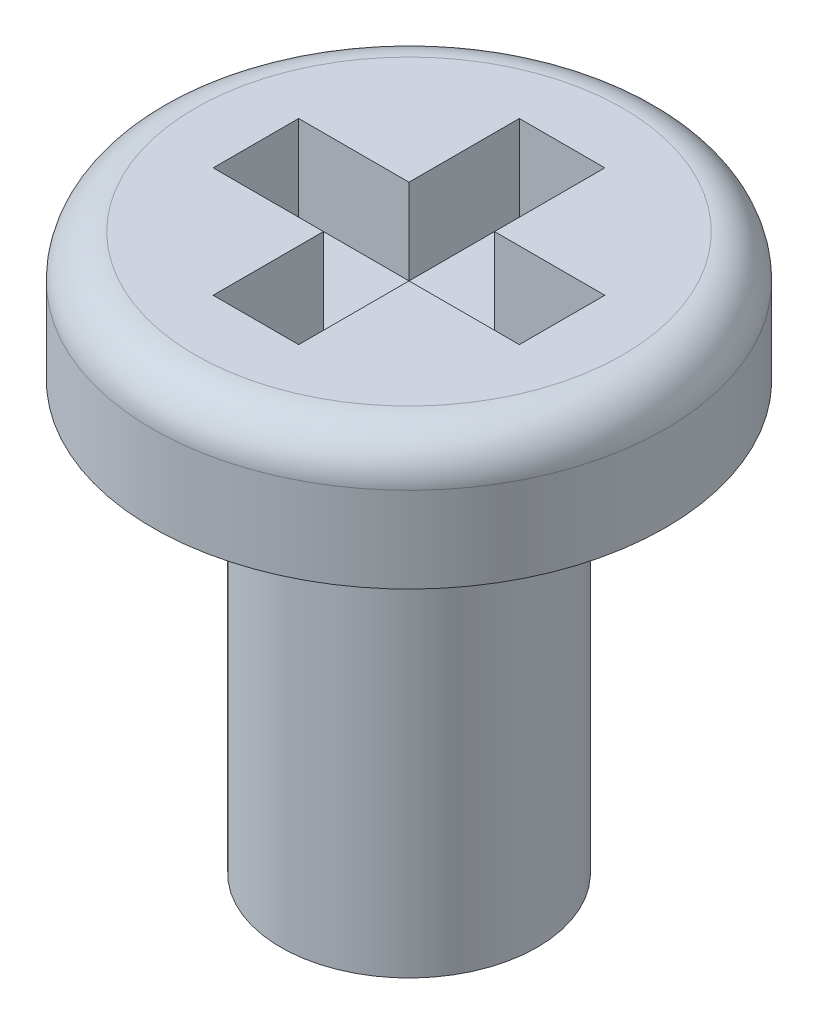
ISO-10303-21;
HEADER;
FILE_DESCRIPTION(('STEP AP214'),'2;1');
FILE_NAME('part.step','',(''),(''),'','','');
FILE_SCHEMA(('AUTOMOTIVE_DESIGN { 1 0 10303 214 1 1 1 1 }'));
ENDSEC;
DATA;
#1=APPLICATION_CONTEXT('core data for automotive mechanical design processes');
#2=APPLICATION_PROTOCOL_DEFINITION('international standard','automotive_design',2000,#1);
#3=PRODUCT_CONTEXT('',#1,'mechanical');
#4=PRODUCT('Part','Part','',(#3));
#5=PRODUCT_RELATED_PRODUCT_CATEGORY('part','',(#4));
#6=PRODUCT_DEFINITION_FORMATION('','',#4);
#7=PRODUCT_DEFINITION_CONTEXT('part definition',#1,'design');
#8=PRODUCT_DEFINITION('design','',#6,#7);
#9=PRODUCT_DEFINITION_SHAPE('','',#8);
#10=(LENGTH_UNIT() NAMED_UNIT(*) SI_UNIT(.MILLI.,.METRE.));
#11=(NAMED_UNIT(*) PLANE_ANGLE_UNIT() SI_UNIT($,.RADIAN.));
#12=(NAMED_UNIT(*) SI_UNIT($,.STERADIAN.) SOLID_ANGLE_UNIT());
#13=UNCERTAINTY_MEASURE_WITH_UNIT(LENGTH_MEASURE(1.E-05),#10,'distance_accuracy_value','');
#14=(GEOMETRIC_REPRESENTATION_CONTEXT(3) GLOBAL_UNCERTAINTY_ASSIGNED_CONTEXT((#13)) GLOBAL_UNIT_ASSIGNED_CONTEXT((#10,
#11,#12)) REPRESENTATION_CONTEXT('',''));
#15=CARTESIAN_POINT('',(0.,0.,0.));
#16=DIRECTION('',(0.,0.,1.));
#17=DIRECTION('',(1.,0.,0.));
#18=AXIS2_PLACEMENT_3D('',#15,#16,#17);
#19=CARTESIAN_POINT('',(-3.,1.75,0.));
#20=DIRECTION('',(0.,1.,0.));
#21=DIRECTION('',(-1.,0.,0.));
#22=AXIS2_PLACEMENT_3D('',#19,#20,#21);
#23=PLANE('',#22);
#24=CARTESIAN_POINT('',(0.,1.75,0.));
#25=DIRECTION('',(0.,-1.,0.));
#26=DIRECTION('',(1.,0.,0.));
#27=AXIS2_PLACEMENT_3D('',#24,#25,#26);
#28=CIRCLE('',#27,1.5);
#29=CARTESIAN_POINT('',(1.5,1.75,0.));
#30=VERTEX_POINT('',#29);
#31=EDGE_CURVE('E12',#30,#30,#28,.T.);
#32=ORIENTED_EDGE('',*,*,#31,.F.);
#33=EDGE_LOOP('',(#32));
#34=FACE_BOUND('',#33,.T.);
#35=CARTESIAN_POINT('',(0.,1.75,0.));
#36=DIRECTION('',(0.,-1.,0.));
#37=DIRECTION('',(1.,0.,0.));
#38=AXIS2_PLACEMENT_3D('',#35,#36,#37);
#39=CIRCLE('',#38,3.);
#40=CARTESIAN_POINT('',(3.,1.75,0.));
#41=VERTEX_POINT('',#40);
#42=EDGE_CURVE('E201',#41,#41,#39,.T.);
#43=ORIENTED_EDGE('',*,*,#42,.T.);
#44=EDGE_LOOP('',(#43));
#45=FACE_BOUND('',#44,.T.);
#46=ADVANCED_FACE('F38',(#34,#45),#23,.F.);
#47=CARTESIAN_POINT('',(0.,-3.25,0.));
#48=DIRECTION('',(0.,-1.,0.));
#49=DIRECTION('',(1.,0.,0.));
#50=AXIS2_PLACEMENT_3D('',#47,#48,#49);
#51=CYLINDRICAL_SURFACE('',#50,1.5);
#52=CARTESIAN_POINT('',(0.,-3.25,0.));
#53=DIRECTION('',(0.,-1.,0.));
#54=DIRECTION('',(1.,0.,0.));
#55=AXIS2_PLACEMENT_3D('',#52,#53,#54);
#56=CIRCLE('',#55,1.5);
#57=CARTESIAN_POINT('',(1.5,-3.25,0.));
#58=VERTEX_POINT('',#57);
#59=EDGE_CURVE('E45',#58,#58,#56,.T.);
#60=ORIENTED_EDGE('',*,*,#59,.F.);
#61=EDGE_LOOP('',(#60));
#62=FACE_BOUND('',#61,.T.);
#63=ORIENTED_EDGE('',*,*,#31,.T.);
#64=EDGE_LOOP('',(#63));
#65=FACE_BOUND('',#64,.T.);
#66=ADVANCED_FACE('F215',(#62,#65),#51,.T.);
#67=CARTESIAN_POINT('',(-1.5,-3.25,0.));
#68=DIRECTION('',(0.,1.,0.));
#69=DIRECTION('',(-1.,0.,0.));
#70=AXIS2_PLACEMENT_3D('',#67,#68,#69);
#71=PLANE('',#70);
#72=ORIENTED_EDGE('',*,*,#59,.T.);
#73=EDGE_LOOP('',(#72));
#74=FACE_BOUND('',#73,.T.);
#75=ADVANCED_FACE('F213',(#74),#71,.F.);
#76=CARTESIAN_POINT('',(0.,3.25,0.));
#77=DIRECTION('',(0.,-1.,0.));
#78=DIRECTION('',(1.,0.,0.));
#79=AXIS2_PLACEMENT_3D('',#76,#77,#78);
#80=PLANE('',#79);
#81=DIRECTION('',(-1.,0.,0.));
#82=VECTOR('',#81,1.);
#83=CARTESIAN_POINT('',(-0.5,3.25,-0.5));
#84=LINE('',#83,#82);
#85=CARTESIAN_POINT('',(-0.5,3.25,-0.5));
#86=VERTEX_POINT('',#85);
#87=CARTESIAN_POINT('',(-1.79032258064516,3.25,-0.5));
#88=VERTEX_POINT('',#87);
#89=EDGE_CURVE('E142',#86,#88,#84,.T.);
#90=ORIENTED_EDGE('',*,*,#89,.F.);
#91=DIRECTION('',(0.,0.,1.));
#92=VECTOR('',#91,1.);
#93=CARTESIAN_POINT('',(-0.500000000000001,3.25,-1.79032258064516));
#94=LINE('',#93,#92);
#95=CARTESIAN_POINT('',(-0.500000000000001,3.25,-1.79032258064516));
#96=VERTEX_POINT('',#95);
#97=EDGE_CURVE('E52',#96,#86,#94,.T.);
#98=ORIENTED_EDGE('',*,*,#97,.F.);
#99=DIRECTION('',(-1.,0.,0.));
#100=VECTOR('',#99,1.);
#101=CARTESIAN_POINT('',(-0.500000000000001,3.25,-1.79032258064516));
#102=LINE('',#101,#100);
#103=CARTESIAN_POINT('',(0.499999999999999,3.25,-1.79032258064516));
#104=VERTEX_POINT('',#103);
#105=EDGE_CURVE('E176',#104,#96,#102,.T.);
#106=ORIENTED_EDGE('',*,*,#105,.F.);
#107=DIRECTION('',(0.,0.,-1.));
#108=VECTOR('',#107,1.);
#109=CARTESIAN_POINT('',(0.499999999999999,3.25,-1.79032258064516));
#110=LINE('',#109,#108);
#111=CARTESIAN_POINT('',(0.499999999999998,3.25,-0.5));
#112=VERTEX_POINT('',#111);
#113=EDGE_CURVE('E173',#112,#104,#110,.T.);
#114=ORIENTED_EDGE('',*,*,#113,.F.);
#115=DIRECTION('',(-1.,0.,0.));
#116=VECTOR('',#115,1.);
#117=CARTESIAN_POINT('',(0.499999999999998,3.25,-0.5));
#118=LINE('',#117,#116);
#119=CARTESIAN_POINT('',(1.79032258064516,3.25,-0.5));
#120=VERTEX_POINT('',#119);
#121=EDGE_CURVE('E170',#120,#112,#118,.T.);
#122=ORIENTED_EDGE('',*,*,#121,.F.);
#123=DIRECTION('',(0.,0.,-1.));
#124=VECTOR('',#123,1.);
#125=CARTESIAN_POINT('',(1.79032258064516,3.25,-0.5));
#126=LINE('',#125,#124);
#127=CARTESIAN_POINT('',(1.79032258064516,3.25,0.5));
#128=VERTEX_POINT('',#127);
#129=EDGE_CURVE('E167',#128,#120,#126,.T.);
#130=ORIENTED_EDGE('',*,*,#129,.F.);
#131=DIRECTION('',(1.,0.,0.));
#132=VECTOR('',#131,1.);
#133=CARTESIAN_POINT('',(0.499999999999996,3.25,0.5));
#134=LINE('',#133,#132);
#135=CARTESIAN_POINT('',(0.499999999999996,3.25,0.5));
#136=VERTEX_POINT('',#135);
#137=EDGE_CURVE('E164',#136,#128,#134,.T.);
#138=ORIENTED_EDGE('',*,*,#137,.F.);
#139=DIRECTION('',(0.,0.,-1.));
#140=VECTOR('',#139,1.);
#141=CARTESIAN_POINT('',(0.499999999999996,3.25,0.5));
#142=LINE('',#141,#140);
#143=CARTESIAN_POINT('',(0.499999999999997,3.25,1.79032258064516));
#144=VERTEX_POINT('',#143);
#145=EDGE_CURVE('E161',#144,#136,#142,.T.);
#146=ORIENTED_EDGE('',*,*,#145,.F.);
#147=DIRECTION('',(1.,0.,0.));
#148=VECTOR('',#147,1.);
#149=CARTESIAN_POINT('',(0.499999999999997,3.25,1.79032258064516));
#150=LINE('',#149,#148);
#151=CARTESIAN_POINT('',(-0.500000000000003,3.25,1.79032258064516));
#152=VERTEX_POINT('',#151);
#153=EDGE_CURVE('E158',#152,#144,#150,.T.);
#154=ORIENTED_EDGE('',*,*,#153,.F.);
#155=DIRECTION('',(0.,0.,1.));
#156=VECTOR('',#155,1.);
#157=CARTESIAN_POINT('',(-0.500000000000001,3.25,0.5));
#158=LINE('',#157,#156);
#159=CARTESIAN_POINT('',(-0.500000000000001,3.25,0.5));
#160=VERTEX_POINT('',#159);
#161=EDGE_CURVE('E152',#160,#152,#158,.T.);
#162=ORIENTED_EDGE('',*,*,#161,.F.);
#163=DIRECTION('',(1.,0.,0.));
#164=VECTOR('',#163,1.);
#165=CARTESIAN_POINT('',(-0.500000000000001,3.25,0.5));
#166=LINE('',#165,#164);
#167=CARTESIAN_POINT('',(-1.79032258064516,3.25,0.5));
#168=VERTEX_POINT('',#167);
#169=EDGE_CURVE('E150',#168,#160,#166,.T.);
#170=ORIENTED_EDGE('',*,*,#169,.F.);
#171=DIRECTION('',(0.,0.,1.));
#172=VECTOR('',#171,1.);
#173=CARTESIAN_POINT('',(-1.79032258064516,3.25,0.5));
#174=LINE('',#173,#172);
#175=EDGE_CURVE('E133',#88,#168,#174,.T.);
#176=ORIENTED_EDGE('',*,*,#175,.F.);
#177=EDGE_LOOP('',(#90,#98,#106,#114,#122,#130,#138,#146,#154,#162,#170,#176));
#178=FACE_BOUND('',#177,.T.);
#179=CARTESIAN_POINT('',(0.,3.25,0.));
#180=DIRECTION('',(0.,-1.,0.));
#181=DIRECTION('',(1.,0.,0.));
#182=AXIS2_PLACEMENT_3D('',#179,#180,#181);
#183=CIRCLE('',#182,2.5);
#184=CARTESIAN_POINT('',(2.5,3.25,0.));
#185=VERTEX_POINT('',#184);
#186=EDGE_CURVE('E208',#185,#185,#183,.T.);
#187=ORIENTED_EDGE('',*,*,#186,.F.);
#188=EDGE_LOOP('',(#187));
#189=FACE_BOUND('',#188,.T.);
#190=ADVANCED_FACE('F146',(#178,#189),#80,.F.);
#191=CARTESIAN_POINT('',(0.,2.75,0.));
#192=DIRECTION('',(0.,-1.,0.));
#193=DIRECTION('',(1.,0.,0.));
#194=AXIS2_PLACEMENT_3D('',#191,#192,#193);
#195=TOROIDAL_SURFACE('',#194,2.5,0.5);
#196=CARTESIAN_POINT('',(0.,2.75,0.));
#197=DIRECTION('',(0.,-1.,0.));
#198=DIRECTION('',(1.,0.,0.));
#199=AXIS2_PLACEMENT_3D('',#196,#197,#198);
#200=CIRCLE('',#199,3.);
#201=CARTESIAN_POINT('',(3.,2.75,0.));
#202=VERTEX_POINT('',#201);
#203=EDGE_CURVE('E205',#202,#202,#200,.T.);
#204=ORIENTED_EDGE('',*,*,#203,.F.);
#205=EDGE_LOOP('',(#204));
#206=FACE_BOUND('',#205,.T.);
#207=ORIENTED_EDGE('',*,*,#186,.T.);
#208=EDGE_LOOP('',(#207));
#209=FACE_BOUND('',#208,.T.);
#210=ADVANCED_FACE('F228',(#206,#209),#195,.T.);
#211=CARTESIAN_POINT('',(0.,-3.25,0.));
#212=DIRECTION('',(0.,-1.,0.));
#213=DIRECTION('',(1.,0.,0.));
#214=AXIS2_PLACEMENT_3D('',#211,#212,#213);
#215=CYLINDRICAL_SURFACE('',#214,3.);
#216=ORIENTED_EDGE('',*,*,#42,.F.);
#217=EDGE_LOOP('',(#216));
#218=FACE_BOUND('',#217,.T.);
#219=ORIENTED_EDGE('',*,*,#203,.T.);
#220=EDGE_LOOP('',(#219));
#221=FACE_BOUND('',#220,.T.);
#222=ADVANCED_FACE('F224',(#218,#221),#215,.T.);
#223=CARTESIAN_POINT('',(-0.5,-3.31379694914238,-1.79032258064516));
#224=DIRECTION('',(-1.,0.,0.));
#225=DIRECTION('',(0.,0.,1.));
#226=AXIS2_PLACEMENT_3D('',#223,#224,#225);
#227=PLANE('',#226);
#228=DIRECTION('',(0.,0.,-1.));
#229=VECTOR('',#228,1.);
#230=CARTESIAN_POINT('',(-0.500000000000001,2.25,-1.79032258064516));
#231=LINE('',#230,#229);
#232=CARTESIAN_POINT('',(-0.5,2.25,-0.5));
#233=VERTEX_POINT('',#232);
#234=CARTESIAN_POINT('',(-0.500000000000001,2.25,-1.79032258064516));
#235=VERTEX_POINT('',#234);
#236=EDGE_CURVE('E202',#233,#235,#231,.T.);
#237=ORIENTED_EDGE('',*,*,#236,.T.);
#238=DIRECTION('',(0.,1.,0.));
#239=VECTOR('',#238,1.);
#240=CARTESIAN_POINT('',(-0.5,-3.31379694914238,-1.79032258064516));
#241=LINE('',#240,#239);
#242=EDGE_CURVE('E179',#235,#96,#241,.T.);
#243=ORIENTED_EDGE('',*,*,#242,.T.);
#244=ORIENTED_EDGE('',*,*,#97,.T.);
#245=DIRECTION('',(0.,1.,0.));
#246=VECTOR('',#245,1.);
#247=CARTESIAN_POINT('',(-0.5,-3.31379694914238,-0.5));
#248=LINE('',#247,#246);
#249=EDGE_CURVE('E139',#233,#86,#248,.T.);
#250=ORIENTED_EDGE('',*,*,#249,.F.);
#251=EDGE_LOOP('',(#237,#243,#244,#250));
#252=FACE_BOUND('',#251,.T.);
#253=ADVANCED_FACE('F227',(#252),#227,.F.);
#254=CARTESIAN_POINT('',(-0.5,-3.31379694914238,-1.79032258064516));
#255=DIRECTION('',(0.,0.,-1.));
#256=DIRECTION('',(-1.,0.,0.));
#257=AXIS2_PLACEMENT_3D('',#254,#255,#256);
#258=PLANE('',#257);
#259=DIRECTION('',(1.,0.,0.));
#260=VECTOR('',#259,1.);
#261=CARTESIAN_POINT('',(-0.500000000000001,2.25,-1.79032258064516));
#262=LINE('',#261,#260);
#263=CARTESIAN_POINT('',(0.499999999999999,2.25,-1.79032258064516));
#264=VERTEX_POINT('',#263);
#265=EDGE_CURVE('E292',#235,#264,#262,.T.);
#266=ORIENTED_EDGE('',*,*,#265,.T.);
#267=DIRECTION('',(0.,1.,0.));
#268=VECTOR('',#267,1.);
#269=CARTESIAN_POINT('',(0.5,-3.31379694914238,-1.79032258064516));
#270=LINE('',#269,#268);
#271=EDGE_CURVE('E181',#264,#104,#270,.T.);
#272=ORIENTED_EDGE('',*,*,#271,.T.);
#273=ORIENTED_EDGE('',*,*,#105,.T.);
#274=ORIENTED_EDGE('',*,*,#242,.F.);
#275=EDGE_LOOP('',(#266,#272,#273,#274));
#276=FACE_BOUND('',#275,.T.);
#277=ADVANCED_FACE('F245',(#276),#258,.F.);
#278=CARTESIAN_POINT('',(0.5,-3.31379694914238,-1.79032258064516));
#279=DIRECTION('',(1.,0.,0.));
#280=DIRECTION('',(0.,0.,-1.));
#281=AXIS2_PLACEMENT_3D('',#278,#279,#280);
#282=PLANE('',#281);
#283=DIRECTION('',(0.,0.,1.));
#284=VECTOR('',#283,1.);
#285=CARTESIAN_POINT('',(0.499999999999999,2.25,-1.79032258064516));
#286=LINE('',#285,#284);
#287=CARTESIAN_POINT('',(0.499999999999998,2.25,-0.5));
#288=VERTEX_POINT('',#287);
#289=EDGE_CURVE('E295',#264,#288,#286,.T.);
#290=ORIENTED_EDGE('',*,*,#289,.T.);
#291=DIRECTION('',(0.,1.,0.));
#292=VECTOR('',#291,1.);
#293=CARTESIAN_POINT('',(0.499999999999999,-3.31379694914238,-0.5));
#294=LINE('',#293,#292);
#295=EDGE_CURVE('E183',#288,#112,#294,.T.);
#296=ORIENTED_EDGE('',*,*,#295,.T.);
#297=ORIENTED_EDGE('',*,*,#113,.T.);
#298=ORIENTED_EDGE('',*,*,#271,.F.);
#299=EDGE_LOOP('',(#290,#296,#297,#298));
#300=FACE_BOUND('',#299,.T.);
#301=ADVANCED_FACE('F277',(#300),#282,.F.);
#302=CARTESIAN_POINT('',(0.499999999999999,-3.31379694914238,-0.5));
#303=DIRECTION('',(0.,0.,-1.));
#304=DIRECTION('',(-1.,0.,0.));
#305=AXIS2_PLACEMENT_3D('',#302,#303,#304);
#306=PLANE('',#305);
#307=DIRECTION('',(1.,0.,0.));
#308=VECTOR('',#307,1.);
#309=CARTESIAN_POINT('',(0.499999999999998,2.25,-0.5));
#310=LINE('',#309,#308);
#311=CARTESIAN_POINT('',(1.79032258064516,2.25,-0.5));
#312=VERTEX_POINT('',#311);
#313=EDGE_CURVE('E299',#288,#312,#310,.T.);
#314=ORIENTED_EDGE('',*,*,#313,.T.);
#315=DIRECTION('',(0.,1.,0.));
#316=VECTOR('',#315,1.);
#317=CARTESIAN_POINT('',(1.79032258064516,-3.31379694914238,-0.5));
#318=LINE('',#317,#316);
#319=EDGE_CURVE('E185',#312,#120,#318,.T.);
#320=ORIENTED_EDGE('',*,*,#319,.T.);
#321=ORIENTED_EDGE('',*,*,#121,.T.);
#322=ORIENTED_EDGE('',*,*,#295,.F.);
#323=EDGE_LOOP('',(#314,#320,#321,#322));
#324=FACE_BOUND('',#323,.T.);
#325=ADVANCED_FACE('F273',(#324),#306,.F.);
#326=CARTESIAN_POINT('',(1.79032258064516,-3.31379694914238,-0.5));
#327=DIRECTION('',(1.,0.,0.));
#328=DIRECTION('',(0.,1.,0.));
#329=AXIS2_PLACEMENT_3D('',#326,#327,#328);
#330=PLANE('',#329);
#331=DIRECTION('',(0.,0.,1.));
#332=VECTOR('',#331,1.);
#333=CARTESIAN_POINT('',(1.79032258064516,2.25,-0.5));
#334=LINE('',#333,#332);
#335=CARTESIAN_POINT('',(1.79032258064516,2.25,0.5));
#336=VERTEX_POINT('',#335);
#337=EDGE_CURVE('E301',#312,#336,#334,.T.);
#338=ORIENTED_EDGE('',*,*,#337,.T.);
#339=DIRECTION('',(0.,1.,0.));
#340=VECTOR('',#339,1.);
#341=CARTESIAN_POINT('',(1.79032258064516,-3.31379694914238,0.5));
#342=LINE('',#341,#340);
#343=EDGE_CURVE('E187',#336,#128,#342,.T.);
#344=ORIENTED_EDGE('',*,*,#343,.T.);
#345=ORIENTED_EDGE('',*,*,#129,.T.);
#346=ORIENTED_EDGE('',*,*,#319,.F.);
#347=EDGE_LOOP('',(#338,#344,#345,#346));
#348=FACE_BOUND('',#347,.T.);
#349=ADVANCED_FACE('F269',(#348),#330,.F.);
#350=CARTESIAN_POINT('',(0.499999999999997,-3.31379694914238,0.5));
#351=DIRECTION('',(0.,0.,1.));
#352=DIRECTION('',(1.,0.,0.));
#353=AXIS2_PLACEMENT_3D('',#350,#351,#352);
#354=PLANE('',#353);
#355=DIRECTION('',(-1.,0.,0.));
#356=VECTOR('',#355,1.);
#357=CARTESIAN_POINT('',(0.499999999999997,2.25,0.5));
#358=LINE('',#357,#356);
#359=CARTESIAN_POINT('',(0.499999999999997,2.25,0.5));
#360=VERTEX_POINT('',#359);
#361=EDGE_CURVE('E303',#336,#360,#358,.T.);
#362=ORIENTED_EDGE('',*,*,#361,.T.);
#363=DIRECTION('',(0.,1.,0.));
#364=VECTOR('',#363,1.);
#365=CARTESIAN_POINT('',(0.499999999999997,-3.31379694914238,0.5));
#366=LINE('',#365,#364);
#367=EDGE_CURVE('E189',#360,#136,#366,.T.);
#368=ORIENTED_EDGE('',*,*,#367,.T.);
#369=ORIENTED_EDGE('',*,*,#137,.T.);
#370=ORIENTED_EDGE('',*,*,#343,.F.);
#371=EDGE_LOOP('',(#362,#368,#369,#370));
#372=FACE_BOUND('',#371,.T.);
#373=ADVANCED_FACE('F265',(#372),#354,.F.);
#374=CARTESIAN_POINT('',(0.499999999999997,-3.31379694914238,0.5));
#375=DIRECTION('',(1.,0.,0.));
#376=DIRECTION('',(0.,1.,0.));
#377=AXIS2_PLACEMENT_3D('',#374,#375,#376);
#378=PLANE('',#377);
#379=DIRECTION('',(0.,0.,1.));
#380=VECTOR('',#379,1.);
#381=CARTESIAN_POINT('',(0.499999999999997,2.25,0.5));
#382=LINE('',#381,#380);
#383=CARTESIAN_POINT('',(0.499999999999997,2.25,1.79032258064516));
#384=VERTEX_POINT('',#383);
#385=EDGE_CURVE('E305',#360,#384,#382,.T.);
#386=ORIENTED_EDGE('',*,*,#385,.T.);
#387=DIRECTION('',(0.,1.,0.));
#388=VECTOR('',#387,1.);
#389=CARTESIAN_POINT('',(0.499999999999997,-3.31379694914238,1.79032258064516));
#390=LINE('',#389,#388);
#391=EDGE_CURVE('E191',#384,#144,#390,.T.);
#392=ORIENTED_EDGE('',*,*,#391,.T.);
#393=ORIENTED_EDGE('',*,*,#145,.T.);
#394=ORIENTED_EDGE('',*,*,#367,.F.);
#395=EDGE_LOOP('',(#386,#392,#393,#394));
#396=FACE_BOUND('',#395,.T.);
#397=ADVANCED_FACE('F261',(#396),#378,.F.);
#398=CARTESIAN_POINT('',(0.499999999999997,-3.31379694914238,1.79032258064516));
#399=DIRECTION('',(0.,0.,1.));
#400=DIRECTION('',(1.,0.,0.));
#401=AXIS2_PLACEMENT_3D('',#398,#399,#400);
#402=PLANE('',#401);
#403=DIRECTION('',(-1.,0.,0.));
#404=VECTOR('',#403,1.);
#405=CARTESIAN_POINT('',(0.499999999999997,2.25,1.79032258064516));
#406=LINE('',#405,#404);
#407=CARTESIAN_POINT('',(-0.500000000000003,2.25,1.79032258064516));
#408=VERTEX_POINT('',#407);
#409=EDGE_CURVE('E307',#384,#408,#406,.T.);
#410=ORIENTED_EDGE('',*,*,#409,.T.);
#411=DIRECTION('',(0.,1.,0.));
#412=VECTOR('',#411,1.);
#413=CARTESIAN_POINT('',(-0.500000000000003,-3.31379694914238,1.79032258064516));
#414=LINE('',#413,#412);
#415=EDGE_CURVE('E193',#408,#152,#414,.T.);
#416=ORIENTED_EDGE('',*,*,#415,.T.);
#417=ORIENTED_EDGE('',*,*,#153,.T.);
#418=ORIENTED_EDGE('',*,*,#391,.F.);
#419=EDGE_LOOP('',(#410,#416,#417,#418));
#420=FACE_BOUND('',#419,.T.);
#421=ADVANCED_FACE('F257',(#420),#402,.F.);
#422=CARTESIAN_POINT('',(-0.5,-3.31379694914238,0.5));
#423=DIRECTION('',(-1.,0.,0.));
#424=DIRECTION('',(0.,0.,1.));
#425=AXIS2_PLACEMENT_3D('',#422,#423,#424);
#426=PLANE('',#425);
#427=DIRECTION('',(0.,0.,-1.));
#428=VECTOR('',#427,1.);
#429=CARTESIAN_POINT('',(-0.500000000000001,2.25,0.5));
#430=LINE('',#429,#428);
#431=CARTESIAN_POINT('',(-0.5,2.25,0.5));
#432=VERTEX_POINT('',#431);
#433=EDGE_CURVE('E309',#408,#432,#430,.T.);
#434=ORIENTED_EDGE('',*,*,#433,.T.);
#435=DIRECTION('',(0.,1.,0.));
#436=VECTOR('',#435,1.);
#437=CARTESIAN_POINT('',(-0.5,-3.31379694914238,0.5));
#438=LINE('',#437,#436);
#439=EDGE_CURVE('E195',#432,#160,#438,.T.);
#440=ORIENTED_EDGE('',*,*,#439,.T.);
#441=ORIENTED_EDGE('',*,*,#161,.T.);
#442=ORIENTED_EDGE('',*,*,#415,.F.);
#443=EDGE_LOOP('',(#434,#440,#441,#442));
#444=FACE_BOUND('',#443,.T.);
#445=ADVANCED_FACE('F254',(#444),#426,.F.);
#446=CARTESIAN_POINT('',(-0.5,-3.31379694914238,0.5));
#447=DIRECTION('',(0.,0.,1.));
#448=DIRECTION('',(1.,0.,0.));
#449=AXIS2_PLACEMENT_3D('',#446,#447,#448);
#450=PLANE('',#449);
#451=DIRECTION('',(-1.,0.,0.));
#452=VECTOR('',#451,1.);
#453=CARTESIAN_POINT('',(-0.500000000000001,2.25,0.5));
#454=LINE('',#453,#452);
#455=CARTESIAN_POINT('',(-1.79032258064516,2.25,0.5));
#456=VERTEX_POINT('',#455);
#457=EDGE_CURVE('E60',#432,#456,#454,.T.);
#458=ORIENTED_EDGE('',*,*,#457,.T.);
#459=DIRECTION('',(0.,1.,0.));
#460=VECTOR('',#459,1.);
#461=CARTESIAN_POINT('',(-1.79032258064516,-3.31379694914238,0.5));
#462=LINE('',#461,#460);
#463=EDGE_CURVE('E138',#456,#168,#462,.T.);
#464=ORIENTED_EDGE('',*,*,#463,.T.);
#465=ORIENTED_EDGE('',*,*,#169,.T.);
#466=ORIENTED_EDGE('',*,*,#439,.F.);
#467=EDGE_LOOP('',(#458,#464,#465,#466));
#468=FACE_BOUND('',#467,.T.);
#469=ADVANCED_FACE('F251',(#468),#450,.F.);
#470=CARTESIAN_POINT('',(-1.79032258064516,-3.31379694914238,0.5));
#471=DIRECTION('',(-1.,0.,0.));
#472=DIRECTION('',(0.,0.,1.));
#473=AXIS2_PLACEMENT_3D('',#470,#471,#472);
#474=PLANE('',#473);
#475=DIRECTION('',(0.,0.,-1.));
#476=VECTOR('',#475,1.);
#477=CARTESIAN_POINT('',(-1.79032258064516,2.25,0.5));
#478=LINE('',#477,#476);
#479=CARTESIAN_POINT('',(-1.79032258064516,2.25,-0.5));
#480=VERTEX_POINT('',#479);
#481=EDGE_CURVE('E135',#456,#480,#478,.T.);
#482=ORIENTED_EDGE('',*,*,#481,.T.);
#483=DIRECTION('',(0.,1.,0.));
#484=VECTOR('',#483,1.);
#485=CARTESIAN_POINT('',(-1.79032258064516,-3.31379694914238,-0.5));
#486=LINE('',#485,#484);
#487=EDGE_CURVE('E128',#480,#88,#486,.T.);
#488=ORIENTED_EDGE('',*,*,#487,.T.);
#489=ORIENTED_EDGE('',*,*,#175,.T.);
#490=ORIENTED_EDGE('',*,*,#463,.F.);
#491=EDGE_LOOP('',(#482,#488,#489,#490));
#492=FACE_BOUND('',#491,.T.);
#493=ADVANCED_FACE('F130',(#492),#474,.F.);
#494=CARTESIAN_POINT('',(-0.5,-3.31379694914238,-0.5));
#495=DIRECTION('',(0.,0.,-1.));
#496=DIRECTION('',(-1.,0.,0.));
#497=AXIS2_PLACEMENT_3D('',#494,#495,#496);
#498=PLANE('',#497);
#499=DIRECTION('',(1.,0.,0.));
#500=VECTOR('',#499,1.);
#501=CARTESIAN_POINT('',(-0.5,2.25,-0.5));
#502=LINE('',#501,#500);
#503=EDGE_CURVE('E199',#480,#233,#502,.T.);
#504=ORIENTED_EDGE('',*,*,#503,.T.);
#505=ORIENTED_EDGE('',*,*,#249,.T.);
#506=ORIENTED_EDGE('',*,*,#89,.T.);
#507=ORIENTED_EDGE('',*,*,#487,.F.);
#508=EDGE_LOOP('',(#504,#505,#506,#507));
#509=FACE_BOUND('',#508,.T.);
#510=ADVANCED_FACE('F143',(#509),#498,.F.);
#511=CARTESIAN_POINT('',(-3.,2.25,0.));
#512=DIRECTION('',(0.,1.,0.));
#513=DIRECTION('',(-1.,0.,0.));
#514=AXIS2_PLACEMENT_3D('',#511,#512,#513);
#515=PLANE('',#514);
#516=ORIENTED_EDGE('',*,*,#236,.F.);
#517=ORIENTED_EDGE('',*,*,#503,.F.);
#518=ORIENTED_EDGE('',*,*,#481,.F.);
#519=ORIENTED_EDGE('',*,*,#457,.F.);
#520=ORIENTED_EDGE('',*,*,#433,.F.);
#521=ORIENTED_EDGE('',*,*,#409,.F.);
#522=ORIENTED_EDGE('',*,*,#385,.F.);
#523=ORIENTED_EDGE('',*,*,#361,.F.);
#524=ORIENTED_EDGE('',*,*,#337,.F.);
#525=ORIENTED_EDGE('',*,*,#313,.F.);
#526=ORIENTED_EDGE('',*,*,#289,.F.);
#527=ORIENTED_EDGE('',*,*,#265,.F.);
#528=EDGE_LOOP('',(#516,#517,#518,#519,#520,#521,#522,#523,#524,#525,#526,#527));
#529=FACE_BOUND('',#528,.T.);
#530=ADVANCED_FACE('F248',(#529),#515,.T.);
#531=CLOSED_SHELL('',(#46,#66,#75,#190,#210,#222,#253,#277,#301,#325,#349,#373,#397,#421,#445,
#469,#493,#510,#530));
#532=MANIFOLD_SOLID_BREP('B2',#531);
#533=ADVANCED_BREP_SHAPE_REPRESENTATION('',(#18,#532),#14);
#534=SHAPE_DEFINITION_REPRESENTATION(#9,#533);
ENDSEC;
END-ISO-10303-21;
